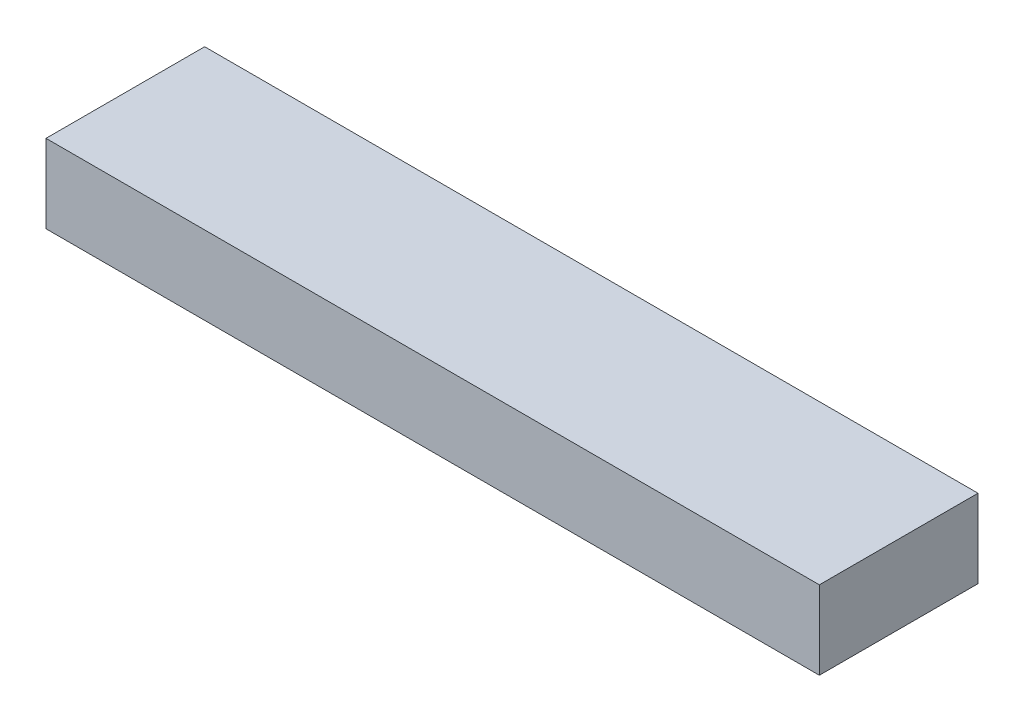
ISO-10303-21;
HEADER;
FILE_DESCRIPTION(('STEP AP214'),'2;1');
FILE_NAME('part.step','',(''),(''),'','','');
FILE_SCHEMA(('AUTOMOTIVE_DESIGN { 1 0 10303 214 1 1 1 1 }'));
ENDSEC;
DATA;
#1=APPLICATION_CONTEXT('core data for automotive mechanical design processes');
#2=APPLICATION_PROTOCOL_DEFINITION('international standard','automotive_design',2000,#1);
#3=PRODUCT_CONTEXT('',#1,'mechanical');
#4=PRODUCT('Part','Part','',(#3));
#5=PRODUCT_RELATED_PRODUCT_CATEGORY('part','',(#4));
#6=PRODUCT_DEFINITION_FORMATION('','',#4);
#7=PRODUCT_DEFINITION_CONTEXT('part definition',#1,'design');
#8=PRODUCT_DEFINITION('design','',#6,#7);
#9=PRODUCT_DEFINITION_SHAPE('','',#8);
#10=(LENGTH_UNIT() NAMED_UNIT(*) SI_UNIT(.MILLI.,.METRE.));
#11=(NAMED_UNIT(*) PLANE_ANGLE_UNIT() SI_UNIT($,.RADIAN.));
#12=(NAMED_UNIT(*) SI_UNIT($,.STERADIAN.) SOLID_ANGLE_UNIT());
#13=UNCERTAINTY_MEASURE_WITH_UNIT(LENGTH_MEASURE(1.E-05),#10,'distance_accuracy_value','');
#14=(GEOMETRIC_REPRESENTATION_CONTEXT(3) GLOBAL_UNCERTAINTY_ASSIGNED_CONTEXT((#13)) GLOBAL_UNIT_ASSIGNED_CONTEXT((#10,
#11,#12)) REPRESENTATION_CONTEXT('',''));
#15=CARTESIAN_POINT('',(0.,0.,0.));
#16=DIRECTION('',(0.,0.,1.));
#17=DIRECTION('',(1.,0.,0.));
#18=AXIS2_PLACEMENT_3D('',#15,#16,#17);
#19=CARTESIAN_POINT('',(0.,0.,0.));
#20=DIRECTION('',(0.,1.,0.));
#21=DIRECTION('',(0.,0.,1.));
#22=AXIS2_PLACEMENT_3D('',#19,#20,#21);
#23=PLANE('',#22);
#24=DIRECTION('',(0.,0.,1.));
#25=VECTOR('',#24,1.);
#26=CARTESIAN_POINT('',(65.9570418283513,7.18337370653585E-13,-102.87));
#27=LINE('',#26,#25);
#28=CARTESIAN_POINT('',(65.9570418283513,7.18337370653585E-13,-102.87));
#29=VERTEX_POINT('',#28);
#30=CARTESIAN_POINT('',(65.9570418283513,-7.18337370653585E-13,102.87));
#31=VERTEX_POINT('',#30);
#32=EDGE_CURVE('E159',#29,#31,#27,.T.);
#33=ORIENTED_EDGE('',*,*,#32,.F.);
#34=DIRECTION('',(-1.,0.,0.));
#35=VECTOR('',#34,1.);
#36=CARTESIAN_POINT('',(65.9570418283513,7.18337370653585E-13,-102.87));
#37=LINE('',#36,#35);
#38=CARTESIAN_POINT('',(1068.87972752298,7.18337370653585E-13,-102.87));
#39=VERTEX_POINT('',#38);
#40=EDGE_CURVE('E164',#39,#29,#37,.T.);
#41=ORIENTED_EDGE('',*,*,#40,.F.);
#42=DIRECTION('',(0.,0.,-1.));
#43=VECTOR('',#42,1.);
#44=CARTESIAN_POINT('',(1068.87972752298,7.18337370653585E-13,-102.87));
#45=LINE('',#44,#43);
#46=CARTESIAN_POINT('',(1068.87972752298,-7.18337370653584E-13,102.87));
#47=VERTEX_POINT('',#46);
#48=EDGE_CURVE('E175',#47,#39,#45,.T.);
#49=ORIENTED_EDGE('',*,*,#48,.F.);
#50=DIRECTION('',(1.,0.,0.));
#51=VECTOR('',#50,1.);
#52=CARTESIAN_POINT('',(65.9570418283513,-7.18337370653585E-13,102.87));
#53=LINE('',#52,#51);
#54=EDGE_CURVE('E173',#31,#47,#53,.T.);
#55=ORIENTED_EDGE('',*,*,#54,.F.);
#56=EDGE_LOOP('',(#33,#41,#49,#55));
#57=FACE_BOUND('',#56,.T.);
#58=DIRECTION('',(-0.173648177666928,0.,-0.984807753012208));
#59=VECTOR('',#58,1.);
#60=CARTESIAN_POINT('',(1041.4,0.,-83.8199999999999));
#61=LINE('',#60,#59);
#62=CARTESIAN_POINT('',(1056.17972752298,0.,0.));
#63=VERTEX_POINT('',#62);
#64=CARTESIAN_POINT('',(1041.86262328683,0.,-81.1963329640924));
#65=VERTEX_POINT('',#64);
#66=EDGE_CURVE('E389',#63,#65,#61,.T.);
#67=ORIENTED_EDGE('',*,*,#66,.T.);
#68=CARTESIAN_POINT('',(1038.73585867101,5.63141025142009E-13,-80.645));
#69=DIRECTION('',(0.,1.,0.));
#70=DIRECTION('',(0.,0.,1.));
#71=AXIS2_PLACEMENT_3D('',#68,#69,#70);
#72=CIRCLE('',#71,3.175);
#73=CARTESIAN_POINT('',(1038.73585867101,0.,-83.8199999999999));
#74=VERTEX_POINT('',#73);
#75=EDGE_CURVE('E201',#65,#74,#72,.T.);
#76=ORIENTED_EDGE('',*,*,#75,.T.);
#77=DIRECTION('',(-1.,0.,0.));
#78=VECTOR('',#77,1.);
#79=CARTESIAN_POINT('',(838.2,0.,-83.82));
#80=LINE('',#79,#78);
#81=CARTESIAN_POINT('',(838.2,5.95576921114116E-13,-83.82));
#82=VERTEX_POINT('',#81);
#83=EDGE_CURVE('E225',#74,#82,#80,.T.);
#84=ORIENTED_EDGE('',*,*,#83,.T.);
#85=CARTESIAN_POINT('',(838.2,0.,-83.82));
#86=CARTESIAN_POINT('',(835.489248783608,0.,-83.8132601169452));
#87=CARTESIAN_POINT('',(830.067936092992,0.,-83.7619227730436));
#88=CARTESIAN_POINT('',(819.226060022886,0.,-83.6010160668581));
#89=CARTESIAN_POINT('',(801.909834210439,0.,-83.2142821288757));
#90=CARTESIAN_POINT('',(780.831665682578,0.,-82.5979748954525));
#91=CARTESIAN_POINT('',(749.520698446852,0.,-81.4713954580175));
#92=CARTESIAN_POINT('',(710.693213075303,0.,-79.7712983267604));
#93=CARTESIAN_POINT('',(665.411655564777,0.,-77.427095787684));
#94=CARTESIAN_POINT('',(613.685068308062,0.,-74.3251475114203));
#95=CARTESIAN_POINT('',(561.982906562161,0.,-70.8407285423232));
#96=CARTESIAN_POINT('',(510.306365900539,0.,-66.9955304767201));
#97=CARTESIAN_POINT('',(458.657158448388,0.,-62.7990726167157));
#98=CARTESIAN_POINT('',(407.037815129638,0.,-58.2500710412866));
#99=CARTESIAN_POINT('',(355.451699359427,0.,-53.3377931523086));
#100=CARTESIAN_POINT('',(303.903852309247,0.,-48.03882100725));
#101=CARTESIAN_POINT('',(252.401123307036,0.,-42.3159248194991));
#102=CARTESIAN_POINT('',(200.954778344129,0.,-36.1056904837407));
#103=CARTESIAN_POINT('',(155.955742041513,0.,-30.1523774015375));
#104=CARTESIAN_POINT('',(123.856103976554,0.,-25.4937610306325));
#105=CARTESIAN_POINT('',(104.607343895741,0.,-22.4977343441118));
#106=CARTESIAN_POINT('',(98.1635682934683,0.,-21.4678823555437));
#107=B_SPLINE_CURVE_WITH_KNOTS('',4,(#85,#86,#87,#88,#89,#90,#91,#92,#93,#94,#95,#96,#97,#98,
#99,#100,#101,#102,#103,#104,#105,#106),.UNSPECIFIED.,.F.,.F.,(5,1,1,1,1,1,1,1,1,1,1,1,1,1,1,1,
1,1,5),(0.11938249851022,0.132231734321944,0.145080970133668,0.170779441757117,
0.201482859362511,0.232186276967905,0.293593112657567,0.354999947096596,0.416406782227813,
0.477813617928748,0.539220452781133,0.600627287358869,0.662034122194719,0.723440957161642,
0.784847792089017,0.846254626715341,0.907661460641354,0.9690682936427,1.),.UNSPECIFIED.);
#108=CARTESIAN_POINT('',(100.399641036635,0.,-21.8240499220561));
#109=VERTEX_POINT('',#108);
#110=EDGE_CURVE('E221',#82,#109,#107,.T.);
#111=ORIENTED_EDGE('',*,*,#110,.T.);
#112=CARTESIAN_POINT('',(100.897435280706,1.30499814628121E-13,-18.6883162135647));
#113=DIRECTION('',(0.,1.,0.));
#114=DIRECTION('',(0.,0.,1.));
#115=AXIS2_PLACEMENT_3D('',#112,#113,#114);
#116=CIRCLE('',#115,3.175);
#117=CARTESIAN_POINT('',(97.7706706648801,0.,-19.239649177666));
#118=VERTEX_POINT('',#117);
#119=EDGE_CURVE('E205',#109,#118,#116,.T.);
#120=ORIENTED_EDGE('',*,*,#119,.T.);
#121=DIRECTION('',(-0.173648177666933,0.,0.984807753012208));
#122=VECTOR('',#121,1.);
#123=CARTESIAN_POINT('',(96.6175540704896,0.,-12.7));
#124=LINE('',#123,#122);
#125=CARTESIAN_POINT('',(96.6175540704896,0.,-12.7));
#126=VERTEX_POINT('',#125);
#127=EDGE_CURVE('E220',#118,#126,#124,.T.);
#128=ORIENTED_EDGE('',*,*,#127,.T.);
#129=DIRECTION('',(-1.,0.,0.));
#130=VECTOR('',#129,1.);
#131=CARTESIAN_POINT('',(96.6175540704896,0.,-12.7));
#132=LINE('',#131,#130);
#133=CARTESIAN_POINT('',(86.0390212458834,0.,-12.7));
#134=VERTEX_POINT('',#133);
#135=EDGE_CURVE('E147',#126,#134,#132,.T.);
#136=ORIENTED_EDGE('',*,*,#135,.T.);
#137=CARTESIAN_POINT('',(86.0390212458834,0.,-9.525));
#138=DIRECTION('',(0.,1.,0.));
#139=DIRECTION('',(0.,0.,1.));
#140=AXIS2_PLACEMENT_3D('',#137,#138,#139);
#141=CIRCLE('',#140,3.175);
#142=CARTESIAN_POINT('',(83.1057037301601,0.,-10.7400198977592));
#143=VERTEX_POINT('',#142);
#144=EDGE_CURVE('E43',#134,#143,#141,.T.);
#145=ORIENTED_EDGE('',*,*,#144,.T.);
#146=DIRECTION('',(-0.382683432365092,0.,0.923879532511286));
#147=VECTOR('',#146,1.);
#148=CARTESIAN_POINT('',(83.9175540704896,0.,-12.7));
#149=LINE('',#148,#147);
#150=CARTESIAN_POINT('',(78.6570418283513,0.,0.));
#151=VERTEX_POINT('',#150);
#152=EDGE_CURVE('E223',#143,#151,#149,.T.);
#153=ORIENTED_EDGE('',*,*,#152,.T.);
#154=DIRECTION('',(-0.382683432365092,0.,-0.923879532511286));
#155=VECTOR('',#154,1.);
#156=CARTESIAN_POINT('',(83.9175540704896,0.,12.7));
#157=LINE('',#156,#155);
#158=CARTESIAN_POINT('',(83.1057037301601,0.,10.7400198977592));
#159=VERTEX_POINT('',#158);
#160=EDGE_CURVE('E149',#159,#151,#157,.T.);
#161=ORIENTED_EDGE('',*,*,#160,.F.);
#162=CARTESIAN_POINT('',(86.0390212458834,0.,9.525));
#163=DIRECTION('',(0.,1.,0.));
#164=DIRECTION('',(0.,0.,1.));
#165=AXIS2_PLACEMENT_3D('',#162,#163,#164);
#166=CIRCLE('',#165,3.175);
#167=CARTESIAN_POINT('',(86.0390212458834,0.,12.7));
#168=VERTEX_POINT('',#167);
#169=EDGE_CURVE('E11',#159,#168,#166,.T.);
#170=ORIENTED_EDGE('',*,*,#169,.T.);
#171=DIRECTION('',(-1.,0.,0.));
#172=VECTOR('',#171,1.);
#173=CARTESIAN_POINT('',(96.6175540704896,0.,12.7));
#174=LINE('',#173,#172);
#175=CARTESIAN_POINT('',(96.6175540704896,0.,12.7));
#176=VERTEX_POINT('',#175);
#177=EDGE_CURVE('E138',#176,#168,#174,.T.);
#178=ORIENTED_EDGE('',*,*,#177,.F.);
#179=DIRECTION('',(-0.173648177666933,0.,-0.984807753012208));
#180=VECTOR('',#179,1.);
#181=CARTESIAN_POINT('',(96.6175540704896,0.,12.7));
#182=LINE('',#181,#180);
#183=CARTESIAN_POINT('',(97.7706706648801,-1.34349752139419E-13,19.239649177666));
#184=VERTEX_POINT('',#183);
#185=EDGE_CURVE('E129',#184,#176,#182,.T.);
#186=ORIENTED_EDGE('',*,*,#185,.F.);
#187=CARTESIAN_POINT('',(100.897435280706,-1.30499814628121E-13,18.6883162135647));
#188=DIRECTION('',(0.,1.,0.));
#189=DIRECTION('',(0.,0.,1.));
#190=AXIS2_PLACEMENT_3D('',#187,#188,#189);
#191=CIRCLE('',#190,3.175);
#192=CARTESIAN_POINT('',(100.399641036635,-1.5239652608168E-13,21.8240499220561));
#193=VERTEX_POINT('',#192);
#194=EDGE_CURVE('E207',#184,#193,#191,.T.);
#195=ORIENTED_EDGE('',*,*,#194,.T.);
#196=CARTESIAN_POINT('',(838.2,-5.85311931643663E-13,83.82));
#197=CARTESIAN_POINT('',(835.489248783608,-5.85264867291839E-13,83.8132601169452));
#198=CARTESIAN_POINT('',(830.067936092992,-5.84906380535403E-13,83.7619227730436));
#199=CARTESIAN_POINT('',(819.226060022886,-5.8378277501152E-13,83.6010160668581));
#200=CARTESIAN_POINT('',(801.909834210439,-5.81082226356394E-13,83.2142821288757));
#201=CARTESIAN_POINT('',(780.831665682578,-5.76778575947412E-13,82.5979748954525));
#202=CARTESIAN_POINT('',(749.520698446852,-5.68911713782354E-13,81.4713954580175));
#203=CARTESIAN_POINT('',(710.693213075303,-5.57039998966345E-13,79.7712983267604));
#204=CARTESIAN_POINT('',(665.411655564777,-5.40670520127037E-13,77.427095787684));
#205=CARTESIAN_POINT('',(613.685068308062,-5.19009731085775E-13,74.3251475114203));
#206=CARTESIAN_POINT('',(561.982906562161,-4.94678163471147E-13,70.8407285423232));
#207=CARTESIAN_POINT('',(510.306365900539,-4.67827288890729E-13,66.9955304767201));
#208=CARTESIAN_POINT('',(458.657158448388,-4.38523580275835E-13,62.7990726167157));
#209=CARTESIAN_POINT('',(407.037815129638,-4.06758072053878E-13,58.2500710412866));
#210=CARTESIAN_POINT('',(355.451699359427,-3.72455818892721E-13,53.3377931523086));
#211=CARTESIAN_POINT('',(303.903852309247,-3.35453294173678E-13,48.03882100725));
#212=CARTESIAN_POINT('',(252.401123307036,-2.9549052368634E-13,42.3159248194991));
#213=CARTESIAN_POINT('',(200.954778344129,-2.52124689100054E-13,36.1056904837407));
#214=CARTESIAN_POINT('',(155.955742041513,-2.10552926038448E-13,30.1523774015375));
#215=CARTESIAN_POINT('',(123.856103976554,-1.78021981790759E-13,25.4937610306325));
#216=CARTESIAN_POINT('',(104.607343895741,-1.57100839257433E-13,22.4977343441118));
#217=CARTESIAN_POINT('',(98.1635682934683,-1.49909421257721E-13,21.4678823555437));
#218=B_SPLINE_CURVE_WITH_KNOTS('',4,(#196,#197,#198,#199,#200,#201,#202,#203,#204,#205,#206,
#207,#208,#209,#210,#211,#212,#213,#214,#215,#216,#217),.UNSPECIFIED.,.F.,.F.,(5,1,1,1,1,1,1,1,
1,1,1,1,1,1,1,1,1,1,5),(0.11938249851022,0.132231734321944,0.145080970133668,0.170779441757117,
0.201482859362511,0.232186276967905,0.293593112657567,0.354999947096596,0.416406782227813,
0.477813617928748,0.539220452781133,0.600627287358869,0.662034122194719,0.723440957161642,
0.784847792089017,0.846254626715341,0.907661460641354,0.9690682936427,1.),.UNSPECIFIED.);
#219=CARTESIAN_POINT('',(838.2,-5.85311931643663E-13,83.82));
#220=VERTEX_POINT('',#219);
#221=EDGE_CURVE('E139',#220,#193,#218,.T.);
#222=ORIENTED_EDGE('',*,*,#221,.F.);
#223=DIRECTION('',(-1.,0.,0.));
#224=VECTOR('',#223,1.);
#225=CARTESIAN_POINT('',(838.2,-5.85311931643663E-13,83.82));
#226=LINE('',#225,#224);
#227=CARTESIAN_POINT('',(1038.73585867101,-5.85311931643662E-13,83.8199999999999));
#228=VERTEX_POINT('',#227);
#229=EDGE_CURVE('E218',#228,#220,#226,.T.);
#230=ORIENTED_EDGE('',*,*,#229,.F.);
#231=CARTESIAN_POINT('',(1038.73585867101,-5.63141025142009E-13,80.645));
#232=DIRECTION('',(0.,1.,0.));
#233=DIRECTION('',(0.,0.,1.));
#234=AXIS2_PLACEMENT_3D('',#231,#232,#233);
#235=CIRCLE('',#234,3.175);
#236=CARTESIAN_POINT('',(1041.86262328683,-5.66990962653245E-13,81.1963329640924));
#237=VERTEX_POINT('',#236);
#238=EDGE_CURVE('E203',#228,#237,#235,.T.);
#239=ORIENTED_EDGE('',*,*,#238,.T.);
#240=DIRECTION('',(-0.173648177666928,0.,0.984807753012208));
#241=VECTOR('',#240,1.);
#242=CARTESIAN_POINT('',(1041.4,-5.85311931643662E-13,83.8199999999999));
#243=LINE('',#242,#241);
#244=EDGE_CURVE('E232',#63,#237,#243,.T.);
#245=ORIENTED_EDGE('',*,*,#244,.F.);
#246=EDGE_LOOP('',(#67,#76,#84,#111,#120,#128,#136,#145,#153,#161,#170,#178,#186,#195,#222,#230,
#239,#245));
#247=FACE_BOUND('',#246,.T.);
#248=ADVANCED_FACE('F35',(#57,#247),#23,.F.);
#249=CARTESIAN_POINT('',(65.9570418283513,101.600000000001,-102.869999999999));
#250=DIRECTION('',(1.,0.,0.));
#251=DIRECTION('',(0.,0.,-1.));
#252=AXIS2_PLACEMENT_3D('',#249,#250,#251);
#253=PLANE('',#252);
#254=ORIENTED_EDGE('',*,*,#32,.T.);
#255=DIRECTION('',(0.,-1.,0.));
#256=VECTOR('',#255,1.);
#257=CARTESIAN_POINT('',(65.9570418283513,101.599999999999,102.870000000001));
#258=LINE('',#257,#256);
#259=CARTESIAN_POINT('',(65.9570418283513,101.599999999999,102.870000000001));
#260=VERTEX_POINT('',#259);
#261=EDGE_CURVE('E186',#260,#31,#258,.T.);
#262=ORIENTED_EDGE('',*,*,#261,.F.);
#263=DIRECTION('',(0.,0.,1.));
#264=VECTOR('',#263,1.);
#265=CARTESIAN_POINT('',(65.9570418283513,101.600000000001,-102.869999999999));
#266=LINE('',#265,#264);
#267=CARTESIAN_POINT('',(65.9570418283513,101.600000000001,-102.869999999999));
#268=VERTEX_POINT('',#267);
#269=EDGE_CURVE('E160',#268,#260,#266,.T.);
#270=ORIENTED_EDGE('',*,*,#269,.F.);
#271=DIRECTION('',(0.,-1.,0.));
#272=VECTOR('',#271,1.);
#273=CARTESIAN_POINT('',(65.9570418283513,101.600000000001,-102.869999999999));
#274=LINE('',#273,#272);
#275=EDGE_CURVE('E170',#268,#29,#274,.T.);
#276=ORIENTED_EDGE('',*,*,#275,.T.);
#277=EDGE_LOOP('',(#254,#262,#270,#276));
#278=FACE_BOUND('',#277,.T.);
#279=ADVANCED_FACE('F261',(#278),#253,.F.);
#280=CARTESIAN_POINT('',(65.9570418283513,101.599999999999,102.870000000001));
#281=DIRECTION('',(0.,0.,-1.));
#282=DIRECTION('',(0.,1.,0.));
#283=AXIS2_PLACEMENT_3D('',#280,#281,#282);
#284=PLANE('',#283);
#285=ORIENTED_EDGE('',*,*,#54,.T.);
#286=DIRECTION('',(0.,-1.,0.));
#287=VECTOR('',#286,1.);
#288=CARTESIAN_POINT('',(1068.87972752298,101.599999999999,102.87));
#289=LINE('',#288,#287);
#290=CARTESIAN_POINT('',(1068.87972752298,101.599999999999,102.87));
#291=VERTEX_POINT('',#290);
#292=EDGE_CURVE('E183',#291,#47,#289,.T.);
#293=ORIENTED_EDGE('',*,*,#292,.F.);
#294=DIRECTION('',(1.,0.,0.));
#295=VECTOR('',#294,1.);
#296=CARTESIAN_POINT('',(65.9570418283513,101.599999999999,102.870000000001));
#297=LINE('',#296,#295);
#298=EDGE_CURVE('E163',#260,#291,#297,.T.);
#299=ORIENTED_EDGE('',*,*,#298,.F.);
#300=ORIENTED_EDGE('',*,*,#261,.T.);
#301=EDGE_LOOP('',(#285,#293,#299,#300));
#302=FACE_BOUND('',#301,.T.);
#303=ADVANCED_FACE('F269',(#302),#284,.F.);
#304=CARTESIAN_POINT('',(1068.87972752298,101.600000000001,-102.869999999999));
#305=DIRECTION('',(-1.,0.,0.));
#306=DIRECTION('',(0.,0.,1.));
#307=AXIS2_PLACEMENT_3D('',#304,#305,#306);
#308=PLANE('',#307);
#309=ORIENTED_EDGE('',*,*,#48,.T.);
#310=DIRECTION('',(0.,-1.,0.));
#311=VECTOR('',#310,1.);
#312=CARTESIAN_POINT('',(1068.87972752298,101.600000000001,-102.869999999999));
#313=LINE('',#312,#311);
#314=CARTESIAN_POINT('',(1068.87972752298,101.600000000001,-102.869999999999));
#315=VERTEX_POINT('',#314);
#316=EDGE_CURVE('E180',#315,#39,#313,.T.);
#317=ORIENTED_EDGE('',*,*,#316,.F.);
#318=DIRECTION('',(0.,0.,-1.));
#319=VECTOR('',#318,1.);
#320=CARTESIAN_POINT('',(1068.87972752298,101.600000000001,-102.869999999999));
#321=LINE('',#320,#319);
#322=EDGE_CURVE('E166',#291,#315,#321,.T.);
#323=ORIENTED_EDGE('',*,*,#322,.F.);
#324=ORIENTED_EDGE('',*,*,#292,.T.);
#325=EDGE_LOOP('',(#309,#317,#323,#324));
#326=FACE_BOUND('',#325,.T.);
#327=ADVANCED_FACE('F265',(#326),#308,.F.);
#328=CARTESIAN_POINT('',(65.9570418283513,101.600000000001,-102.869999999999));
#329=DIRECTION('',(0.,0.,1.));
#330=DIRECTION('',(0.,-1.,0.));
#331=AXIS2_PLACEMENT_3D('',#328,#329,#330);
#332=PLANE('',#331);
#333=ORIENTED_EDGE('',*,*,#40,.T.);
#334=ORIENTED_EDGE('',*,*,#275,.F.);
#335=DIRECTION('',(-1.,0.,0.));
#336=VECTOR('',#335,1.);
#337=CARTESIAN_POINT('',(65.9570418283513,101.600000000001,-102.869999999999));
#338=LINE('',#337,#336);
#339=EDGE_CURVE('E168',#315,#268,#338,.T.);
#340=ORIENTED_EDGE('',*,*,#339,.F.);
#341=ORIENTED_EDGE('',*,*,#316,.T.);
#342=EDGE_LOOP('',(#333,#334,#340,#341));
#343=FACE_BOUND('',#342,.T.);
#344=ADVANCED_FACE('F257',(#343),#332,.F.);
#345=CARTESIAN_POINT('',(0.,101.6,7.09469008052925E-13));
#346=DIRECTION('',(0.,1.,0.));
#347=DIRECTION('',(0.,0.,1.));
#348=AXIS2_PLACEMENT_3D('',#345,#346,#347);
#349=PLANE('',#348);
#350=ORIENTED_EDGE('',*,*,#269,.T.);
#351=ORIENTED_EDGE('',*,*,#298,.T.);
#352=ORIENTED_EDGE('',*,*,#322,.T.);
#353=ORIENTED_EDGE('',*,*,#339,.T.);
#354=EDGE_LOOP('',(#350,#351,#352,#353));
#355=FACE_BOUND('',#354,.T.);
#356=ADVANCED_FACE('F253',(#355),#349,.T.);
#357=CARTESIAN_POINT('',(1056.17972752298,0.,0.));
#358=DIRECTION('',(-1.,0.,0.));
#359=DIRECTION('',(0.,0.,1.));
#360=AXIS2_PLACEMENT_3D('',#357,#358,#359);
#361=CONICAL_SURFACE('',#360,0.,1.39626340159547);
#362=ORIENTED_EDGE('',*,*,#244,.T.);
#363=CARTESIAN_POINT('',(1041.86262328683,0.,0.));
#364=DIRECTION('',(-1.,0.,0.));
#365=DIRECTION('',(0.,0.,1.));
#366=AXIS2_PLACEMENT_3D('',#363,#364,#365);
#367=CIRCLE('',#366,81.1963329640924);
#368=EDGE_CURVE('E189',#237,#65,#367,.T.);
#369=ORIENTED_EDGE('',*,*,#368,.T.);
#370=ORIENTED_EDGE('',*,*,#66,.F.);
#371=EDGE_LOOP('',(#362,#369,#370));
#372=FACE_BOUND('',#371,.T.);
#373=ADVANCED_FACE('F249',(#372),#361,.F.);
#374=CARTESIAN_POINT('',(0.,0.,0.));
#375=DIRECTION('',(-1.,0.,0.));
#376=DIRECTION('',(0.,0.,1.));
#377=AXIS2_PLACEMENT_3D('',#374,#375,#376);
#378=CYLINDRICAL_SURFACE('',#377,83.82);
#379=ORIENTED_EDGE('',*,*,#83,.F.);
#380=CARTESIAN_POINT('',(1038.73585867101,0.,0.));
#381=DIRECTION('',(-1.,0.,0.));
#382=DIRECTION('',(0.,0.,1.));
#383=AXIS2_PLACEMENT_3D('',#380,#381,#382);
#384=CIRCLE('',#383,83.82);
#385=EDGE_CURVE('E192',#74,#228,#384,.F.);
#386=ORIENTED_EDGE('',*,*,#385,.T.);
#387=ORIENTED_EDGE('',*,*,#229,.T.);
#388=CARTESIAN_POINT('',(838.2,0.,0.));
#389=DIRECTION('',(-1.,0.,0.));
#390=DIRECTION('',(0.,0.,1.));
#391=AXIS2_PLACEMENT_3D('',#388,#389,#390);
#392=CIRCLE('',#391,83.82);
#393=EDGE_CURVE('E148',#220,#82,#392,.T.);
#394=ORIENTED_EDGE('',*,*,#393,.T.);
#395=EDGE_LOOP('',(#379,#386,#387,#394));
#396=FACE_BOUND('',#395,.T.);
#397=ADVANCED_FACE('F245',(#396),#378,.F.);
#398=CARTESIAN_POINT('',(0.,0.,0.));
#399=DIRECTION('',(-1.,0.,0.));
#400=AXIS1_PLACEMENT('',#398,#399);
#401=SURFACE_OF_REVOLUTION('',#218,#400);
#402=ORIENTED_EDGE('',*,*,#221,.T.);
#403=CARTESIAN_POINT('',(100.399641036635,0.,0.));
#404=DIRECTION('',(-1.,0.,0.));
#405=DIRECTION('',(0.,0.,1.));
#406=AXIS2_PLACEMENT_3D('',#403,#404,#405);
#407=CIRCLE('',#406,21.8240499220561);
#408=EDGE_CURVE('E194',#193,#109,#407,.T.);
#409=ORIENTED_EDGE('',*,*,#408,.T.);
#410=ORIENTED_EDGE('',*,*,#110,.F.);
#411=ORIENTED_EDGE('',*,*,#393,.F.);
#412=EDGE_LOOP('',(#402,#409,#410,#411));
#413=FACE_BOUND('',#412,.T.);
#414=ADVANCED_FACE('F215',(#413),#401,.F.);
#415=CARTESIAN_POINT('',(98.1635682934683,0.,0.));
#416=DIRECTION('',(1.,0.,0.));
#417=DIRECTION('',(0.,0.,-1.));
#418=AXIS2_PLACEMENT_3D('',#415,#416,#417);
#419=CONICAL_SURFACE('',#418,21.4678823555437,1.3962634015934);
#420=ORIENTED_EDGE('',*,*,#127,.F.);
#421=CARTESIAN_POINT('',(97.7706706648935,0.,0.));
#422=DIRECTION('',(1.,0.,0.));
#423=DIRECTION('',(0.,0.,-1.));
#424=AXIS2_PLACEMENT_3D('',#421,#422,#423);
#425=CIRCLE('',#424,19.2396491776636);
#426=EDGE_CURVE('E135',#118,#184,#425,.T.);
#427=ORIENTED_EDGE('',*,*,#426,.T.);
#428=ORIENTED_EDGE('',*,*,#185,.T.);
#429=CARTESIAN_POINT('',(96.6175540704896,0.,0.));
#430=DIRECTION('',(-1.,0.,0.));
#431=DIRECTION('',(0.,0.,1.));
#432=AXIS2_PLACEMENT_3D('',#429,#430,#431);
#433=CIRCLE('',#432,12.7);
#434=EDGE_CURVE('E133',#176,#126,#433,.T.);
#435=ORIENTED_EDGE('',*,*,#434,.T.);
#436=EDGE_LOOP('',(#420,#427,#428,#435));
#437=FACE_BOUND('',#436,.T.);
#438=ADVANCED_FACE('F132',(#437),#419,.F.);
#439=CARTESIAN_POINT('',(0.,0.,0.));
#440=DIRECTION('',(-1.,0.,0.));
#441=DIRECTION('',(0.,0.,1.));
#442=AXIS2_PLACEMENT_3D('',#439,#440,#441);
#443=CYLINDRICAL_SURFACE('',#442,12.7);
#444=ORIENTED_EDGE('',*,*,#177,.T.);
#445=CARTESIAN_POINT('',(86.0390212458834,0.,0.));
#446=DIRECTION('',(-1.,0.,0.));
#447=DIRECTION('',(0.,0.,1.));
#448=AXIS2_PLACEMENT_3D('',#445,#446,#447);
#449=CIRCLE('',#448,12.7);
#450=EDGE_CURVE('E198',#168,#134,#449,.T.);
#451=ORIENTED_EDGE('',*,*,#450,.T.);
#452=ORIENTED_EDGE('',*,*,#135,.F.);
#453=ORIENTED_EDGE('',*,*,#434,.F.);
#454=EDGE_LOOP('',(#444,#451,#452,#453));
#455=FACE_BOUND('',#454,.T.);
#456=ADVANCED_FACE('F144',(#455),#443,.F.);
#457=CARTESIAN_POINT('',(83.9175540704896,0.,0.));
#458=DIRECTION('',(1.,0.,0.));
#459=DIRECTION('',(0.,0.,-1.));
#460=AXIS2_PLACEMENT_3D('',#457,#458,#459);
#461=CONICAL_SURFACE('',#460,12.7,1.17809724509617);
#462=ORIENTED_EDGE('',*,*,#152,.F.);
#463=CARTESIAN_POINT('',(83.1057037301601,0.,0.));
#464=DIRECTION('',(1.,0.,0.));
#465=DIRECTION('',(0.,0.,-1.));
#466=AXIS2_PLACEMENT_3D('',#463,#464,#465);
#467=CIRCLE('',#466,10.7400198977592);
#468=EDGE_CURVE('E56',#143,#159,#467,.T.);
#469=ORIENTED_EDGE('',*,*,#468,.T.);
#470=ORIENTED_EDGE('',*,*,#160,.T.);
#471=EDGE_LOOP('',(#462,#469,#470));
#472=FACE_BOUND('',#471,.T.);
#473=ADVANCED_FACE('F279',(#472),#461,.F.);
#474=CARTESIAN_POINT('',(1038.73585867101,0.,0.));
#475=DIRECTION('',(-1.,0.,0.));
#476=DIRECTION('',(0.,0.,1.));
#477=AXIS2_PLACEMENT_3D('',#474,#475,#476);
#478=TOROIDAL_SURFACE('',#477,80.645,3.175);
#479=ORIENTED_EDGE('',*,*,#238,.F.);
#480=ORIENTED_EDGE('',*,*,#385,.F.);
#481=ORIENTED_EDGE('',*,*,#75,.F.);
#482=ORIENTED_EDGE('',*,*,#368,.F.);
#483=EDGE_LOOP('',(#479,#480,#481,#482));
#484=FACE_BOUND('',#483,.T.);
#485=ADVANCED_FACE('F277',(#484),#478,.F.);
#486=CARTESIAN_POINT('',(100.897435280706,0.,0.));
#487=DIRECTION('',(-1.,0.,0.));
#488=DIRECTION('',(0.,0.,1.));
#489=AXIS2_PLACEMENT_3D('',#486,#487,#488);
#490=TOROIDAL_SURFACE('',#489,18.6883162135647,3.175);
#491=ORIENTED_EDGE('',*,*,#194,.F.);
#492=ORIENTED_EDGE('',*,*,#426,.F.);
#493=ORIENTED_EDGE('',*,*,#119,.F.);
#494=ORIENTED_EDGE('',*,*,#408,.F.);
#495=EDGE_LOOP('',(#491,#492,#493,#494));
#496=FACE_BOUND('',#495,.T.);
#497=ADVANCED_FACE('F219',(#496),#490,.F.);
#498=CARTESIAN_POINT('',(86.0390212458834,0.,0.));
#499=DIRECTION('',(-1.,0.,0.));
#500=DIRECTION('',(0.,0.,1.));
#501=AXIS2_PLACEMENT_3D('',#498,#499,#500);
#502=TOROIDAL_SURFACE('',#501,9.525,3.175);
#503=ORIENTED_EDGE('',*,*,#169,.F.);
#504=ORIENTED_EDGE('',*,*,#468,.F.);
#505=ORIENTED_EDGE('',*,*,#144,.F.);
#506=ORIENTED_EDGE('',*,*,#450,.F.);
#507=EDGE_LOOP('',(#503,#504,#505,#506));
#508=FACE_BOUND('',#507,.T.);
#509=ADVANCED_FACE('F37',(#508),#502,.F.);
#510=CLOSED_SHELL('',(#248,#279,#303,#327,#344,#356,#373,#397,#414,#438,#456,#473,#485,#497,#509));
#511=MANIFOLD_SOLID_BREP('B2',#510);
#512=ADVANCED_BREP_SHAPE_REPRESENTATION('',(#18,#511),#14);
#513=SHAPE_DEFINITION_REPRESENTATION(#9,#512);
ENDSEC;
END-ISO-10303-21;
